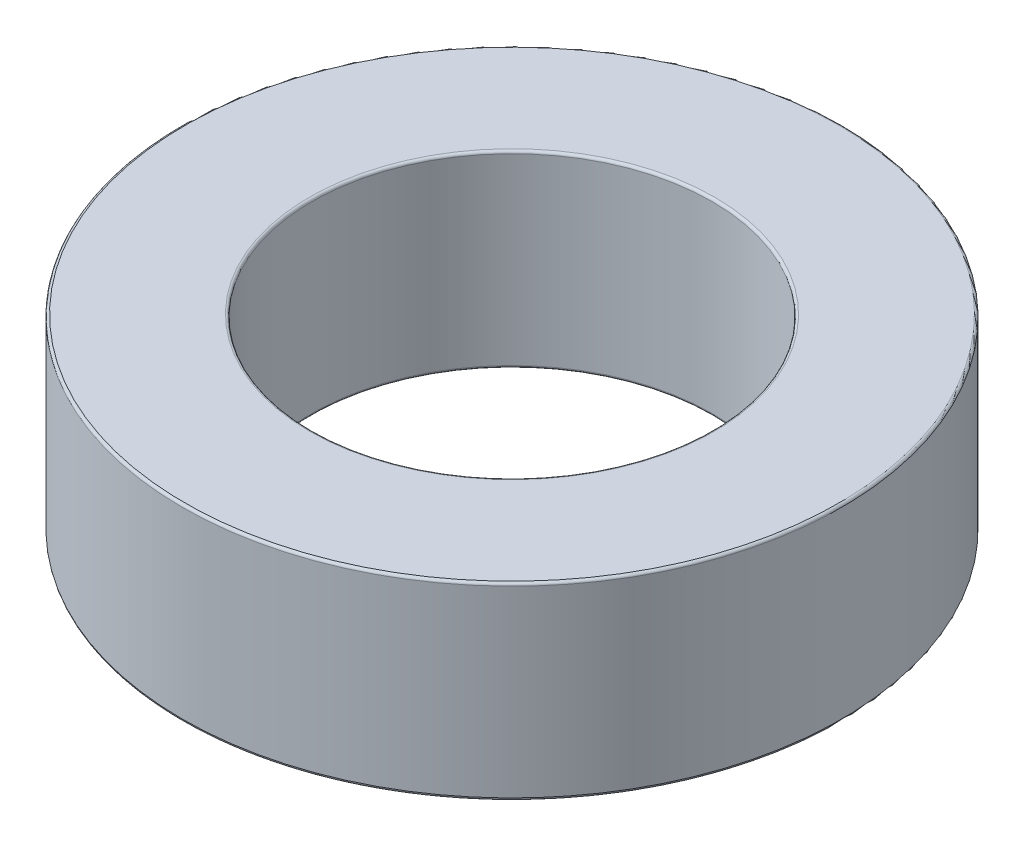
ISO-10303-21;
HEADER;
FILE_DESCRIPTION(('STEP AP214'),'2;1');
FILE_NAME('part.step','',(''),(''),'','','');
FILE_SCHEMA(('AUTOMOTIVE_DESIGN { 1 0 10303 214 1 1 1 1 }'));
ENDSEC;
DATA;
#1=APPLICATION_CONTEXT('core data for automotive mechanical design processes');
#2=APPLICATION_PROTOCOL_DEFINITION('international standard','automotive_design',2000,#1);
#3=PRODUCT_CONTEXT('',#1,'mechanical');
#4=PRODUCT('Part','Part','',(#3));
#5=PRODUCT_RELATED_PRODUCT_CATEGORY('part','',(#4));
#6=PRODUCT_DEFINITION_FORMATION('','',#4);
#7=PRODUCT_DEFINITION_CONTEXT('part definition',#1,'design');
#8=PRODUCT_DEFINITION('design','',#6,#7);
#9=PRODUCT_DEFINITION_SHAPE('','',#8);
#10=(LENGTH_UNIT() NAMED_UNIT(*) SI_UNIT(.MILLI.,.METRE.));
#11=(NAMED_UNIT(*) PLANE_ANGLE_UNIT() SI_UNIT($,.RADIAN.));
#12=(NAMED_UNIT(*) SI_UNIT($,.STERADIAN.) SOLID_ANGLE_UNIT());
#13=UNCERTAINTY_MEASURE_WITH_UNIT(LENGTH_MEASURE(1.E-05),#10,'distance_accuracy_value','');
#14=(GEOMETRIC_REPRESENTATION_CONTEXT(3) GLOBAL_UNCERTAINTY_ASSIGNED_CONTEXT((#13)) GLOBAL_UNIT_ASSIGNED_CONTEXT((#10,
#11,#12)) REPRESENTATION_CONTEXT('',''));
#15=CARTESIAN_POINT('',(0.,0.,0.));
#16=DIRECTION('',(0.,0.,1.));
#17=DIRECTION('',(1.,0.,0.));
#18=AXIS2_PLACEMENT_3D('',#15,#16,#17);
#19=CARTESIAN_POINT('',(0.,0.146058458634107,0.));
#20=DIRECTION('',(0.,-1.,0.));
#21=DIRECTION('',(0.,0.,-1.));
#22=AXIS2_PLACEMENT_3D('',#19,#20,#21);
#23=TOROIDAL_SURFACE('',#22,11.5973939397357,0.146058458634107);
#24=CARTESIAN_POINT('',(0.,0.,0.));
#25=DIRECTION('',(0.,-1.,0.));
#26=DIRECTION('',(0.,0.,-1.));
#27=AXIS2_PLACEMENT_3D('',#24,#25,#26);
#28=CIRCLE('',#27,11.5973939397357);
#29=CARTESIAN_POINT('',(0.,0.,-11.5973939397357));
#30=VERTEX_POINT('',#29);
#31=EDGE_CURVE('E59',#30,#30,#28,.T.);
#32=ORIENTED_EDGE('',*,*,#31,.T.);
#33=EDGE_LOOP('',(#32));
#34=FACE_BOUND('',#33,.T.);
#35=CARTESIAN_POINT('',(0.,0.146058458634107,0.));
#36=DIRECTION('',(0.,-1.,0.));
#37=DIRECTION('',(0.,0.,-1.));
#38=AXIS2_PLACEMENT_3D('',#35,#36,#37);
#39=CIRCLE('',#38,11.4513354811016);
#40=CARTESIAN_POINT('',(0.,0.146058458634107,-11.4513354811016));
#41=VERTEX_POINT('',#40);
#42=EDGE_CURVE('E10',#41,#41,#39,.T.);
#43=ORIENTED_EDGE('',*,*,#42,.F.);
#44=EDGE_LOOP('',(#43));
#45=FACE_BOUND('',#44,.T.);
#46=ADVANCED_FACE('F31',(#34,#45),#23,.T.);
#47=CARTESIAN_POINT('',(0.,-8.10797227513854,0.));
#48=DIRECTION('',(0.,-1.,0.));
#49=DIRECTION('',(0.,0.,-1.));
#50=AXIS2_PLACEMENT_3D('',#47,#48,#49);
#51=CYLINDRICAL_SURFACE('',#50,11.4513354811016);
#52=ORIENTED_EDGE('',*,*,#42,.T.);
#53=EDGE_LOOP('',(#52));
#54=FACE_BOUND('',#53,.T.);
#55=CARTESIAN_POINT('',(0.,10.640147278535,0.));
#56=DIRECTION('',(0.,-1.,0.));
#57=DIRECTION('',(0.,0.,-1.));
#58=AXIS2_PLACEMENT_3D('',#55,#56,#57);
#59=CIRCLE('',#58,11.4513354811016);
#60=CARTESIAN_POINT('',(0.,10.640147278535,-11.4513354811016));
#61=VERTEX_POINT('',#60);
#62=EDGE_CURVE('E37',#61,#61,#59,.T.);
#63=ORIENTED_EDGE('',*,*,#62,.F.);
#64=EDGE_LOOP('',(#63));
#65=FACE_BOUND('',#64,.T.);
#66=ADVANCED_FACE('F77',(#54,#65),#51,.F.);
#67=CARTESIAN_POINT('',(0.,10.640147278535,0.));
#68=DIRECTION('',(0.,-1.,0.));
#69=DIRECTION('',(0.,0.,-1.));
#70=AXIS2_PLACEMENT_3D('',#67,#68,#69);
#71=TOROIDAL_SURFACE('',#70,11.5973939397357,0.146058458634107);
#72=ORIENTED_EDGE('',*,*,#62,.T.);
#73=EDGE_LOOP('',(#72));
#74=FACE_BOUND('',#73,.T.);
#75=CARTESIAN_POINT('',(0.,10.7862057371691,0.));
#76=DIRECTION('',(0.,-1.,0.));
#77=DIRECTION('',(0.,0.,-1.));
#78=AXIS2_PLACEMENT_3D('',#75,#76,#77);
#79=CIRCLE('',#78,11.5973939397357);
#80=CARTESIAN_POINT('',(0.,10.7862057371691,-11.5973939397357));
#81=VERTEX_POINT('',#80);
#82=EDGE_CURVE('E41',#81,#81,#79,.T.);
#83=ORIENTED_EDGE('',*,*,#82,.F.);
#84=EDGE_LOOP('',(#83));
#85=FACE_BOUND('',#84,.T.);
#86=ADVANCED_FACE('F81',(#74,#85),#71,.T.);
#87=CARTESIAN_POINT('',(11.5973939397357,10.7862057371691,0.));
#88=DIRECTION('',(0.,1.,0.));
#89=DIRECTION('',(0.,0.,1.));
#90=AXIS2_PLACEMENT_3D('',#87,#88,#89);
#91=PLANE('',#90);
#92=ORIENTED_EDGE('',*,*,#82,.T.);
#93=EDGE_LOOP('',(#92));
#94=FACE_BOUND('',#93,.T.);
#95=CARTESIAN_POINT('',(0.,10.7862057371691,0.));
#96=DIRECTION('',(0.,-1.,0.));
#97=DIRECTION('',(0.,0.,-1.));
#98=AXIS2_PLACEMENT_3D('',#95,#96,#97);
#99=CIRCLE('',#98,18.713632534892);
#100=CARTESIAN_POINT('',(0.,10.7862057371691,-18.713632534892));
#101=VERTEX_POINT('',#100);
#102=EDGE_CURVE('E45',#101,#101,#99,.T.);
#103=ORIENTED_EDGE('',*,*,#102,.F.);
#104=EDGE_LOOP('',(#103));
#105=FACE_BOUND('',#104,.T.);
#106=ADVANCED_FACE('F85',(#94,#105),#91,.T.);
#107=CARTESIAN_POINT('',(0.,10.640147278535,0.));
#108=DIRECTION('',(0.,-1.,0.));
#109=DIRECTION('',(0.,0.,-1.));
#110=AXIS2_PLACEMENT_3D('',#107,#108,#109);
#111=TOROIDAL_SURFACE('',#110,18.713632534892,0.146058458634107);
#112=ORIENTED_EDGE('',*,*,#102,.T.);
#113=EDGE_LOOP('',(#112));
#114=FACE_BOUND('',#113,.T.);
#115=CARTESIAN_POINT('',(0.,10.640147278535,0.));
#116=DIRECTION('',(0.,-1.,0.));
#117=DIRECTION('',(0.,0.,-1.));
#118=AXIS2_PLACEMENT_3D('',#115,#116,#117);
#119=CIRCLE('',#118,18.8596909935261);
#120=CARTESIAN_POINT('',(0.,10.640147278535,-18.8596909935261));
#121=VERTEX_POINT('',#120);
#122=EDGE_CURVE('E50',#121,#121,#119,.T.);
#123=ORIENTED_EDGE('',*,*,#122,.F.);
#124=EDGE_LOOP('',(#123));
#125=FACE_BOUND('',#124,.T.);
#126=ADVANCED_FACE('F91',(#114,#125),#111,.T.);
#127=CARTESIAN_POINT('',(0.,-8.10797227513854,0.));
#128=DIRECTION('',(0.,-1.,0.));
#129=DIRECTION('',(0.,0.,-1.));
#130=AXIS2_PLACEMENT_3D('',#127,#128,#129);
#131=CYLINDRICAL_SURFACE('',#130,18.8596909935261);
#132=ORIENTED_EDGE('',*,*,#122,.T.);
#133=EDGE_LOOP('',(#132));
#134=FACE_BOUND('',#133,.T.);
#135=CARTESIAN_POINT('',(0.,0.146058458634107,0.));
#136=DIRECTION('',(0.,-1.,0.));
#137=DIRECTION('',(0.,0.,-1.));
#138=AXIS2_PLACEMENT_3D('',#135,#136,#137);
#139=CIRCLE('',#138,18.8596909935261);
#140=CARTESIAN_POINT('',(0.,0.146058458634107,-18.8596909935261));
#141=VERTEX_POINT('',#140);
#142=EDGE_CURVE('E53',#141,#141,#139,.T.);
#143=ORIENTED_EDGE('',*,*,#142,.F.);
#144=EDGE_LOOP('',(#143));
#145=FACE_BOUND('',#144,.T.);
#146=ADVANCED_FACE('F73',(#134,#145),#131,.T.);
#147=CARTESIAN_POINT('',(0.,0.146058458634107,0.));
#148=DIRECTION('',(0.,-1.,0.));
#149=DIRECTION('',(0.,0.,-1.));
#150=AXIS2_PLACEMENT_3D('',#147,#148,#149);
#151=TOROIDAL_SURFACE('',#150,18.713632534892,0.146058458634107);
#152=ORIENTED_EDGE('',*,*,#142,.T.);
#153=EDGE_LOOP('',(#152));
#154=FACE_BOUND('',#153,.T.);
#155=CARTESIAN_POINT('',(0.,0.,0.));
#156=DIRECTION('',(0.,-1.,0.));
#157=DIRECTION('',(0.,0.,-1.));
#158=AXIS2_PLACEMENT_3D('',#155,#156,#157);
#159=CIRCLE('',#158,18.713632534892);
#160=CARTESIAN_POINT('',(0.,0.,-18.713632534892));
#161=VERTEX_POINT('',#160);
#162=EDGE_CURVE('E56',#161,#161,#159,.T.);
#163=ORIENTED_EDGE('',*,*,#162,.F.);
#164=EDGE_LOOP('',(#163));
#165=FACE_BOUND('',#164,.T.);
#166=ADVANCED_FACE('F67',(#154,#165),#151,.T.);
#167=CARTESIAN_POINT('',(11.5973939397357,0.,0.));
#168=DIRECTION('',(0.,-1.,0.));
#169=DIRECTION('',(0.,0.,-1.));
#170=AXIS2_PLACEMENT_3D('',#167,#168,#169);
#171=PLANE('',#170);
#172=ORIENTED_EDGE('',*,*,#162,.T.);
#173=EDGE_LOOP('',(#172));
#174=FACE_BOUND('',#173,.T.);
#175=ORIENTED_EDGE('',*,*,#31,.F.);
#176=EDGE_LOOP('',(#175));
#177=FACE_BOUND('',#176,.T.);
#178=ADVANCED_FACE('F65',(#174,#177),#171,.T.);
#179=CLOSED_SHELL('',(#46,#66,#86,#106,#126,#146,#166,#178));
#180=MANIFOLD_SOLID_BREP('B2',#179);
#181=ADVANCED_BREP_SHAPE_REPRESENTATION('',(#18,#180),#14);
#182=SHAPE_DEFINITION_REPRESENTATION(#9,#181);
ENDSEC;
END-ISO-10303-21;
